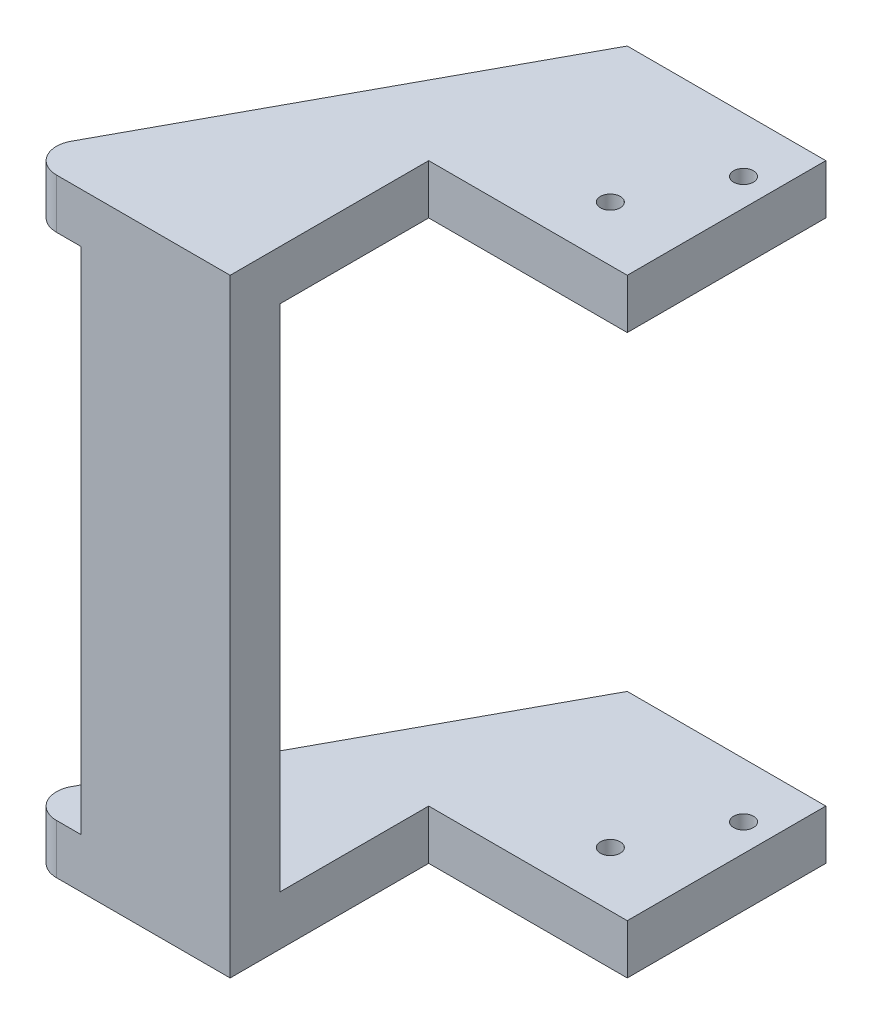
ISO-10303-21;
HEADER;
FILE_DESCRIPTION(('STEP AP214'),'2;1');
FILE_NAME('part.step','',(''),(''),'','','');
FILE_SCHEMA(('AUTOMOTIVE_DESIGN { 1 0 10303 214 1 1 1 1 }'));
ENDSEC;
DATA;
#1=APPLICATION_CONTEXT('core data for automotive mechanical design processes');
#2=APPLICATION_PROTOCOL_DEFINITION('international standard','automotive_design',2000,#1);
#3=PRODUCT_CONTEXT('',#1,'mechanical');
#4=PRODUCT('Part','Part','',(#3));
#5=PRODUCT_RELATED_PRODUCT_CATEGORY('part','',(#4));
#6=PRODUCT_DEFINITION_FORMATION('','',#4);
#7=PRODUCT_DEFINITION_CONTEXT('part definition',#1,'design');
#8=PRODUCT_DEFINITION('design','',#6,#7);
#9=PRODUCT_DEFINITION_SHAPE('','',#8);
#10=(LENGTH_UNIT() NAMED_UNIT(*) SI_UNIT(.MILLI.,.METRE.));
#11=(NAMED_UNIT(*) PLANE_ANGLE_UNIT() SI_UNIT($,.RADIAN.));
#12=(NAMED_UNIT(*) SI_UNIT($,.STERADIAN.) SOLID_ANGLE_UNIT());
#13=UNCERTAINTY_MEASURE_WITH_UNIT(LENGTH_MEASURE(1.E-05),#10,'distance_accuracy_value','');
#14=(GEOMETRIC_REPRESENTATION_CONTEXT(3) GLOBAL_UNCERTAINTY_ASSIGNED_CONTEXT((#13)) GLOBAL_UNIT_ASSIGNED_CONTEXT((#10,
#11,#12)) REPRESENTATION_CONTEXT('',''));
#15=CARTESIAN_POINT('',(0.,0.,0.));
#16=DIRECTION('',(0.,0.,1.));
#17=DIRECTION('',(1.,0.,0.));
#18=AXIS2_PLACEMENT_3D('',#15,#16,#17);
#19=CARTESIAN_POINT('',(-20.,-30.65,40.));
#20=DIRECTION('',(0.,1.,0.));
#21=DIRECTION('',(0.,0.,1.));
#22=AXIS2_PLACEMENT_3D('',#19,#20,#21);
#23=PLANE('',#22);
#24=CARTESIAN_POINT('',(12.765,-30.65,14.47));
#25=DIRECTION('',(0.,-1.,0.));
#26=DIRECTION('',(0.,0.,-1.));
#27=AXIS2_PLACEMENT_3D('',#24,#25,#26);
#28=CIRCLE('',#27,1.);
#29=CARTESIAN_POINT('',(12.765,-30.65,13.47));
#30=VERTEX_POINT('',#29);
#31=EDGE_CURVE('E305',#30,#30,#28,.T.);
#32=ORIENTED_EDGE('',*,*,#31,.F.);
#33=EDGE_LOOP('',(#32));
#34=FACE_BOUND('',#33,.T.);
#35=CARTESIAN_POINT('',(17.2371359549996,-30.65,5.52572809000084));
#36=DIRECTION('',(0.,-1.,0.));
#37=DIRECTION('',(0.,0.,-1.));
#38=AXIS2_PLACEMENT_3D('',#35,#36,#37);
#39=CIRCLE('',#38,1.);
#40=CARTESIAN_POINT('',(17.2371359549996,-30.65,4.52572809000084));
#41=VERTEX_POINT('',#40);
#42=EDGE_CURVE('E310',#41,#41,#39,.T.);
#43=ORIENTED_EDGE('',*,*,#42,.F.);
#44=EDGE_LOOP('',(#43));
#45=FACE_BOUND('',#44,.T.);
#46=DIRECTION('',(1.,0.,0.));
#47=VECTOR('',#46,1.);
#48=CARTESIAN_POINT('',(0.,-30.65,20.));
#49=LINE('',#48,#47);
#50=CARTESIAN_POINT('',(0.,-30.65,20.));
#51=VERTEX_POINT('',#50);
#52=CARTESIAN_POINT('',(20.,-30.65,20.));
#53=VERTEX_POINT('',#52);
#54=EDGE_CURVE('E84',#51,#53,#49,.T.);
#55=ORIENTED_EDGE('',*,*,#54,.F.);
#56=DIRECTION('',(0.,0.,-1.));
#57=VECTOR('',#56,1.);
#58=CARTESIAN_POINT('',(0.,-30.65,0.));
#59=LINE('',#58,#57);
#60=CARTESIAN_POINT('',(0.,-30.65,40.));
#61=VERTEX_POINT('',#60);
#62=EDGE_CURVE('E194',#61,#51,#59,.T.);
#63=ORIENTED_EDGE('',*,*,#62,.F.);
#64=DIRECTION('',(1.,0.,0.));
#65=VECTOR('',#64,1.);
#66=CARTESIAN_POINT('',(-20.,-30.65,40.));
#67=LINE('',#66,#65);
#68=CARTESIAN_POINT('',(-17.5,-30.65,40.));
#69=VERTEX_POINT('',#68);
#70=EDGE_CURVE('E277',#69,#61,#67,.T.);
#71=ORIENTED_EDGE('',*,*,#70,.F.);
#72=CARTESIAN_POINT('',(-17.5,-30.65,37.5));
#73=DIRECTION('',(0.,-1.,0.));
#74=DIRECTION('',(0.,0.,-1.));
#75=AXIS2_PLACEMENT_3D('',#72,#73,#74);
#76=CIRCLE('',#75,2.5);
#77=CARTESIAN_POINT('',(-19.6974514108383,-30.65,36.3078560082755));
#78=VERTEX_POINT('',#77);
#79=EDGE_CURVE('E229',#69,#78,#76,.T.);
#80=ORIENTED_EDGE('',*,*,#79,.T.);
#81=DIRECTION('',(-0.476857596689811,0.,0.878980564335309));
#82=VECTOR('',#81,1.);
#83=CARTESIAN_POINT('',(0.,-30.65,0.));
#84=LINE('',#83,#82);
#85=CARTESIAN_POINT('',(0.,-30.65,0.));
#86=VERTEX_POINT('',#85);
#87=EDGE_CURVE('E202',#86,#78,#84,.T.);
#88=ORIENTED_EDGE('',*,*,#87,.F.);
#89=DIRECTION('',(1.,0.,0.));
#90=VECTOR('',#89,1.);
#91=CARTESIAN_POINT('',(-20.,-30.65,0.));
#92=LINE('',#91,#90);
#93=CARTESIAN_POINT('',(20.,-30.65,0.));
#94=VERTEX_POINT('',#93);
#95=EDGE_CURVE('E274',#86,#94,#92,.T.);
#96=ORIENTED_EDGE('',*,*,#95,.T.);
#97=DIRECTION('',(0.,0.,-1.));
#98=VECTOR('',#97,1.);
#99=CARTESIAN_POINT('',(20.,-30.65,40.));
#100=LINE('',#99,#98);
#101=EDGE_CURVE('E292',#53,#94,#100,.T.);
#102=ORIENTED_EDGE('',*,*,#101,.F.);
#103=EDGE_LOOP('',(#55,#63,#71,#80,#88,#96,#102));
#104=FACE_BOUND('',#103,.T.);
#105=ADVANCED_FACE('F60',(#34,#45,#104),#23,.F.);
#106=CARTESIAN_POINT('',(-20.,30.65,40.));
#107=DIRECTION('',(0.,-1.,0.));
#108=DIRECTION('',(1.,0.,0.));
#109=AXIS2_PLACEMENT_3D('',#106,#107,#108);
#110=PLANE('',#109);
#111=CARTESIAN_POINT('',(12.765,30.65,14.47));
#112=DIRECTION('',(0.,-1.,0.));
#113=DIRECTION('',(0.,0.,-1.));
#114=AXIS2_PLACEMENT_3D('',#111,#112,#113);
#115=CIRCLE('',#114,1.);
#116=CARTESIAN_POINT('',(12.765,30.65,13.47));
#117=VERTEX_POINT('',#116);
#118=EDGE_CURVE('E300',#117,#117,#115,.T.);
#119=ORIENTED_EDGE('',*,*,#118,.T.);
#120=EDGE_LOOP('',(#119));
#121=FACE_BOUND('',#120,.T.);
#122=CARTESIAN_POINT('',(17.2371359549996,30.65,5.52572809000084));
#123=DIRECTION('',(0.,-1.,0.));
#124=DIRECTION('',(0.,0.,-1.));
#125=AXIS2_PLACEMENT_3D('',#122,#123,#124);
#126=CIRCLE('',#125,1.);
#127=CARTESIAN_POINT('',(17.2371359549996,30.65,4.52572809000084));
#128=VERTEX_POINT('',#127);
#129=EDGE_CURVE('E315',#128,#128,#126,.T.);
#130=ORIENTED_EDGE('',*,*,#129,.T.);
#131=EDGE_LOOP('',(#130));
#132=FACE_BOUND('',#131,.T.);
#133=DIRECTION('',(-1.,0.,0.));
#134=VECTOR('',#133,1.);
#135=CARTESIAN_POINT('',(-20.,30.65,40.));
#136=LINE('',#135,#134);
#137=CARTESIAN_POINT('',(0.,30.65,40.));
#138=VERTEX_POINT('',#137);
#139=CARTESIAN_POINT('',(-17.5,30.65,40.));
#140=VERTEX_POINT('',#139);
#141=EDGE_CURVE('E192',#138,#140,#136,.T.);
#142=ORIENTED_EDGE('',*,*,#141,.F.);
#143=DIRECTION('',(0.,0.,-1.));
#144=VECTOR('',#143,1.);
#145=CARTESIAN_POINT('',(0.,30.65,0.));
#146=LINE('',#145,#144);
#147=CARTESIAN_POINT('',(0.,30.65,20.));
#148=VERTEX_POINT('',#147);
#149=EDGE_CURVE('E177',#138,#148,#146,.T.);
#150=ORIENTED_EDGE('',*,*,#149,.T.);
#151=DIRECTION('',(1.,0.,0.));
#152=VECTOR('',#151,1.);
#153=CARTESIAN_POINT('',(0.,30.65,20.));
#154=LINE('',#153,#152);
#155=CARTESIAN_POINT('',(20.,30.65,20.));
#156=VERTEX_POINT('',#155);
#157=EDGE_CURVE('E185',#148,#156,#154,.T.);
#158=ORIENTED_EDGE('',*,*,#157,.T.);
#159=DIRECTION('',(0.,0.,-1.));
#160=VECTOR('',#159,1.);
#161=CARTESIAN_POINT('',(20.,30.65,40.));
#162=LINE('',#161,#160);
#163=CARTESIAN_POINT('',(20.,30.65,0.));
#164=VERTEX_POINT('',#163);
#165=EDGE_CURVE('E282',#156,#164,#162,.T.);
#166=ORIENTED_EDGE('',*,*,#165,.T.);
#167=DIRECTION('',(-1.,0.,0.));
#168=VECTOR('',#167,1.);
#169=CARTESIAN_POINT('',(-20.,30.65,0.));
#170=LINE('',#169,#168);
#171=CARTESIAN_POINT('',(0.,30.65,0.));
#172=VERTEX_POINT('',#171);
#173=EDGE_CURVE('E280',#164,#172,#170,.T.);
#174=ORIENTED_EDGE('',*,*,#173,.T.);
#175=DIRECTION('',(-0.476857596689811,0.,0.878980564335309));
#176=VECTOR('',#175,1.);
#177=CARTESIAN_POINT('',(0.,30.65,0.));
#178=LINE('',#177,#176);
#179=CARTESIAN_POINT('',(-19.6974514108383,30.65,36.3078560082755));
#180=VERTEX_POINT('',#179);
#181=EDGE_CURVE('E204',#172,#180,#178,.T.);
#182=ORIENTED_EDGE('',*,*,#181,.T.);
#183=CARTESIAN_POINT('',(-17.5,30.65,37.5));
#184=DIRECTION('',(0.,-1.,0.));
#185=DIRECTION('',(0.,0.,-1.));
#186=AXIS2_PLACEMENT_3D('',#183,#184,#185);
#187=CIRCLE('',#186,2.5);
#188=EDGE_CURVE('E230',#140,#180,#187,.T.);
#189=ORIENTED_EDGE('',*,*,#188,.F.);
#190=EDGE_LOOP('',(#142,#150,#158,#166,#174,#182,#189));
#191=FACE_BOUND('',#190,.T.);
#192=ADVANCED_FACE('F190',(#121,#132,#191),#110,.F.);
#193=CARTESIAN_POINT('',(0.,-25.65,0.));
#194=DIRECTION('',(0.,-1.,0.));
#195=DIRECTION('',(0.,0.,-1.));
#196=AXIS2_PLACEMENT_3D('',#193,#194,#195);
#197=PLANE('',#196);
#198=CARTESIAN_POINT('',(12.765,-25.65,14.47));
#199=DIRECTION('',(0.,-1.,0.));
#200=DIRECTION('',(0.,0.,-1.));
#201=AXIS2_PLACEMENT_3D('',#198,#199,#200);
#202=CIRCLE('',#201,1.);
#203=CARTESIAN_POINT('',(12.765,-25.65,13.47));
#204=VERTEX_POINT('',#203);
#205=EDGE_CURVE('E197',#204,#204,#202,.T.);
#206=ORIENTED_EDGE('',*,*,#205,.T.);
#207=EDGE_LOOP('',(#206));
#208=FACE_BOUND('',#207,.T.);
#209=CARTESIAN_POINT('',(17.2371359549996,-25.65,5.52572809000084));
#210=DIRECTION('',(0.,-1.,0.));
#211=DIRECTION('',(0.,0.,-1.));
#212=AXIS2_PLACEMENT_3D('',#209,#210,#211);
#213=CIRCLE('',#212,1.);
#214=CARTESIAN_POINT('',(17.2371359549996,-25.65,4.52572809000084));
#215=VERTEX_POINT('',#214);
#216=EDGE_CURVE('E299',#215,#215,#213,.T.);
#217=ORIENTED_EDGE('',*,*,#216,.T.);
#218=EDGE_LOOP('',(#217));
#219=FACE_BOUND('',#218,.T.);
#220=DIRECTION('',(1.,0.,0.));
#221=VECTOR('',#220,1.);
#222=CARTESIAN_POINT('',(-20.,-25.65,35.));
#223=LINE('',#222,#221);
#224=CARTESIAN_POINT('',(-15.,-25.65,35.));
#225=VERTEX_POINT('',#224);
#226=CARTESIAN_POINT('',(0.,-25.65,35.));
#227=VERTEX_POINT('',#226);
#228=EDGE_CURVE('E242',#225,#227,#223,.T.);
#229=ORIENTED_EDGE('',*,*,#228,.T.);
#230=DIRECTION('',(0.,0.,-1.));
#231=VECTOR('',#230,1.);
#232=CARTESIAN_POINT('',(0.,-25.65,0.));
#233=LINE('',#232,#231);
#234=CARTESIAN_POINT('',(0.,-25.65,20.));
#235=VERTEX_POINT('',#234);
#236=EDGE_CURVE('E216',#227,#235,#233,.T.);
#237=ORIENTED_EDGE('',*,*,#236,.T.);
#238=DIRECTION('',(1.,0.,0.));
#239=VECTOR('',#238,1.);
#240=CARTESIAN_POINT('',(0.,-25.65,20.));
#241=LINE('',#240,#239);
#242=CARTESIAN_POINT('',(20.,-25.65,20.));
#243=VERTEX_POINT('',#242);
#244=EDGE_CURVE('E226',#235,#243,#241,.T.);
#245=ORIENTED_EDGE('',*,*,#244,.T.);
#246=DIRECTION('',(0.,0.,1.));
#247=VECTOR('',#246,1.);
#248=CARTESIAN_POINT('',(20.,-25.65,0.));
#249=LINE('',#248,#247);
#250=CARTESIAN_POINT('',(20.,-25.65,0.));
#251=VERTEX_POINT('',#250);
#252=EDGE_CURVE('E269',#251,#243,#249,.T.);
#253=ORIENTED_EDGE('',*,*,#252,.F.);
#254=DIRECTION('',(1.,0.,0.));
#255=VECTOR('',#254,1.);
#256=CARTESIAN_POINT('',(0.,-25.65,0.));
#257=LINE('',#256,#255);
#258=CARTESIAN_POINT('',(0.,-25.65,0.));
#259=VERTEX_POINT('',#258);
#260=EDGE_CURVE('E265',#259,#251,#257,.T.);
#261=ORIENTED_EDGE('',*,*,#260,.F.);
#262=DIRECTION('',(-0.476857596689811,0.,0.878980564335309));
#263=VECTOR('',#262,1.);
#264=CARTESIAN_POINT('',(0.,-25.65,0.));
#265=LINE('',#264,#263);
#266=CARTESIAN_POINT('',(-19.6974514108383,-25.65,36.3078560082755));
#267=VERTEX_POINT('',#266);
#268=EDGE_CURVE('E222',#259,#267,#265,.T.);
#269=ORIENTED_EDGE('',*,*,#268,.T.);
#270=CARTESIAN_POINT('',(-17.5,-25.65,37.5));
#271=DIRECTION('',(0.,-1.,0.));
#272=DIRECTION('',(0.,0.,-1.));
#273=AXIS2_PLACEMENT_3D('',#270,#271,#272);
#274=CIRCLE('',#273,2.5);
#275=CARTESIAN_POINT('',(-17.5,-25.65,40.));
#276=VERTEX_POINT('',#275);
#277=EDGE_CURVE('E237',#276,#267,#274,.T.);
#278=ORIENTED_EDGE('',*,*,#277,.F.);
#279=DIRECTION('',(1.,0.,0.));
#280=VECTOR('',#279,1.);
#281=CARTESIAN_POINT('',(0.,-25.65,40.));
#282=LINE('',#281,#280);
#283=CARTESIAN_POINT('',(-15.,-25.65,40.));
#284=VERTEX_POINT('',#283);
#285=EDGE_CURVE('E251',#276,#284,#282,.T.);
#286=ORIENTED_EDGE('',*,*,#285,.T.);
#287=DIRECTION('',(0.,0.,1.));
#288=VECTOR('',#287,1.);
#289=CARTESIAN_POINT('',(-15.,-25.65,0.));
#290=LINE('',#289,#288);
#291=EDGE_CURVE('E259',#225,#284,#290,.T.);
#292=ORIENTED_EDGE('',*,*,#291,.F.);
#293=EDGE_LOOP('',(#229,#237,#245,#253,#261,#269,#278,#286,#292));
#294=FACE_BOUND('',#293,.T.);
#295=ADVANCED_FACE('F341',(#208,#219,#294),#197,.F.);
#296=CARTESIAN_POINT('',(0.,25.65,0.));
#297=DIRECTION('',(0.,-1.,0.));
#298=DIRECTION('',(0.,0.,-1.));
#299=AXIS2_PLACEMENT_3D('',#296,#297,#298);
#300=PLANE('',#299);
#301=CARTESIAN_POINT('',(12.765,25.65,14.47));
#302=DIRECTION('',(0.,-1.,0.));
#303=DIRECTION('',(0.,0.,-1.));
#304=AXIS2_PLACEMENT_3D('',#301,#302,#303);
#305=CIRCLE('',#304,1.);
#306=CARTESIAN_POINT('',(12.765,25.65,13.47));
#307=VERTEX_POINT('',#306);
#308=EDGE_CURVE('E63',#307,#307,#305,.T.);
#309=ORIENTED_EDGE('',*,*,#308,.F.);
#310=EDGE_LOOP('',(#309));
#311=FACE_BOUND('',#310,.T.);
#312=CARTESIAN_POINT('',(17.2371359549996,25.65,5.52572809000084));
#313=DIRECTION('',(0.,-1.,0.));
#314=DIRECTION('',(0.,0.,-1.));
#315=AXIS2_PLACEMENT_3D('',#312,#313,#314);
#316=CIRCLE('',#315,1.);
#317=CARTESIAN_POINT('',(17.2371359549996,25.65,4.52572809000084));
#318=VERTEX_POINT('',#317);
#319=EDGE_CURVE('E297',#318,#318,#316,.T.);
#320=ORIENTED_EDGE('',*,*,#319,.F.);
#321=EDGE_LOOP('',(#320));
#322=FACE_BOUND('',#321,.T.);
#323=DIRECTION('',(0.,0.,-1.));
#324=VECTOR('',#323,1.);
#325=CARTESIAN_POINT('',(0.,25.65,0.));
#326=LINE('',#325,#324);
#327=CARTESIAN_POINT('',(0.,25.65,35.));
#328=VERTEX_POINT('',#327);
#329=CARTESIAN_POINT('',(0.,25.65,20.));
#330=VERTEX_POINT('',#329);
#331=EDGE_CURVE('E180',#328,#330,#326,.T.);
#332=ORIENTED_EDGE('',*,*,#331,.F.);
#333=DIRECTION('',(1.,0.,0.));
#334=VECTOR('',#333,1.);
#335=CARTESIAN_POINT('',(-20.,25.65,35.));
#336=LINE('',#335,#334);
#337=CARTESIAN_POINT('',(-15.,25.65,35.));
#338=VERTEX_POINT('',#337);
#339=EDGE_CURVE('E243',#338,#328,#336,.T.);
#340=ORIENTED_EDGE('',*,*,#339,.F.);
#341=DIRECTION('',(0.,0.,1.));
#342=VECTOR('',#341,1.);
#343=CARTESIAN_POINT('',(-15.,25.65,0.));
#344=LINE('',#343,#342);
#345=CARTESIAN_POINT('',(-15.,25.65,40.));
#346=VERTEX_POINT('',#345);
#347=EDGE_CURVE('E260',#338,#346,#344,.T.);
#348=ORIENTED_EDGE('',*,*,#347,.T.);
#349=DIRECTION('',(-1.,0.,0.));
#350=VECTOR('',#349,1.);
#351=CARTESIAN_POINT('',(0.,25.65,40.));
#352=LINE('',#351,#350);
#353=CARTESIAN_POINT('',(-17.5,25.65,40.));
#354=VERTEX_POINT('',#353);
#355=EDGE_CURVE('E256',#346,#354,#352,.T.);
#356=ORIENTED_EDGE('',*,*,#355,.T.);
#357=CARTESIAN_POINT('',(-17.5,25.65,37.5));
#358=DIRECTION('',(0.,-1.,0.));
#359=DIRECTION('',(0.,0.,-1.));
#360=AXIS2_PLACEMENT_3D('',#357,#358,#359);
#361=CIRCLE('',#360,2.5);
#362=CARTESIAN_POINT('',(-19.6974514108383,25.65,36.3078560082755));
#363=VERTEX_POINT('',#362);
#364=EDGE_CURVE('E294',#354,#363,#361,.T.);
#365=ORIENTED_EDGE('',*,*,#364,.T.);
#366=DIRECTION('',(-0.476857596689811,0.,0.878980564335309));
#367=VECTOR('',#366,1.);
#368=CARTESIAN_POINT('',(0.,25.65,0.));
#369=LINE('',#368,#367);
#370=CARTESIAN_POINT('',(0.,25.65,0.));
#371=VERTEX_POINT('',#370);
#372=EDGE_CURVE('E219',#371,#363,#369,.T.);
#373=ORIENTED_EDGE('',*,*,#372,.F.);
#374=DIRECTION('',(1.,0.,0.));
#375=VECTOR('',#374,1.);
#376=CARTESIAN_POINT('',(0.,25.65,0.));
#377=LINE('',#376,#375);
#378=CARTESIAN_POINT('',(20.,25.65,0.));
#379=VERTEX_POINT('',#378);
#380=EDGE_CURVE('E267',#371,#379,#377,.T.);
#381=ORIENTED_EDGE('',*,*,#380,.T.);
#382=DIRECTION('',(0.,0.,1.));
#383=VECTOR('',#382,1.);
#384=CARTESIAN_POINT('',(20.,25.65,0.));
#385=LINE('',#384,#383);
#386=CARTESIAN_POINT('',(20.,25.65,20.));
#387=VERTEX_POINT('',#386);
#388=EDGE_CURVE('E271',#379,#387,#385,.T.);
#389=ORIENTED_EDGE('',*,*,#388,.T.);
#390=DIRECTION('',(1.,0.,0.));
#391=VECTOR('',#390,1.);
#392=CARTESIAN_POINT('',(0.,25.65,20.));
#393=LINE('',#392,#391);
#394=EDGE_CURVE('E76',#330,#387,#393,.T.);
#395=ORIENTED_EDGE('',*,*,#394,.F.);
#396=EDGE_LOOP('',(#332,#340,#348,#356,#365,#373,#381,#389,#395));
#397=FACE_BOUND('',#396,.T.);
#398=ADVANCED_FACE('F383',(#311,#322,#397),#300,.T.);
#399=CARTESIAN_POINT('',(0.,0.,40.));
#400=DIRECTION('',(0.,0.,1.));
#401=DIRECTION('',(1.,0.,0.));
#402=AXIS2_PLACEMENT_3D('',#399,#400,#401);
#403=PLANE('',#402);
#404=DIRECTION('',(0.,-1.,0.));
#405=VECTOR('',#404,1.);
#406=CARTESIAN_POINT('',(0.,25.65,40.));
#407=LINE('',#406,#405);
#408=EDGE_CURVE('E262',#138,#61,#407,.T.);
#409=ORIENTED_EDGE('',*,*,#408,.F.);
#410=ORIENTED_EDGE('',*,*,#141,.T.);
#411=DIRECTION('',(0.,-1.,0.));
#412=VECTOR('',#411,1.);
#413=CARTESIAN_POINT('',(-17.5,30.65,40.));
#414=LINE('',#413,#412);
#415=EDGE_CURVE('E234',#140,#354,#414,.T.);
#416=ORIENTED_EDGE('',*,*,#415,.T.);
#417=ORIENTED_EDGE('',*,*,#355,.F.);
#418=DIRECTION('',(0.,1.,0.));
#419=VECTOR('',#418,1.);
#420=CARTESIAN_POINT('',(-15.,0.,40.));
#421=LINE('',#420,#419);
#422=EDGE_CURVE('E253',#284,#346,#421,.T.);
#423=ORIENTED_EDGE('',*,*,#422,.F.);
#424=ORIENTED_EDGE('',*,*,#285,.F.);
#425=EDGE_CURVE('E232',#276,#69,#414,.T.);
#426=ORIENTED_EDGE('',*,*,#425,.T.);
#427=ORIENTED_EDGE('',*,*,#70,.T.);
#428=EDGE_LOOP('',(#409,#410,#416,#417,#423,#424,#426,#427));
#429=FACE_BOUND('',#428,.T.);
#430=ADVANCED_FACE('F361',(#429),#403,.T.);
#431=CARTESIAN_POINT('',(0.,0.,0.));
#432=DIRECTION('',(0.,0.,1.));
#433=DIRECTION('',(1.,0.,0.));
#434=AXIS2_PLACEMENT_3D('',#431,#432,#433);
#435=PLANE('',#434);
#436=ORIENTED_EDGE('',*,*,#380,.F.);
#437=DIRECTION('',(0.,-1.,0.));
#438=VECTOR('',#437,1.);
#439=CARTESIAN_POINT('',(0.,30.65,0.));
#440=LINE('',#439,#438);
#441=EDGE_CURVE('E207',#172,#371,#440,.T.);
#442=ORIENTED_EDGE('',*,*,#441,.F.);
#443=ORIENTED_EDGE('',*,*,#173,.F.);
#444=DIRECTION('',(0.,1.,0.));
#445=VECTOR('',#444,1.);
#446=CARTESIAN_POINT('',(20.,30.65,0.));
#447=LINE('',#446,#445);
#448=EDGE_CURVE('E285',#379,#164,#447,.T.);
#449=ORIENTED_EDGE('',*,*,#448,.F.);
#450=EDGE_LOOP('',(#436,#442,#443,#449));
#451=FACE_BOUND('',#450,.T.);
#452=ADVANCED_FACE('F393',(#451),#435,.F.);
#453=CARTESIAN_POINT('',(20.,30.65,40.));
#454=DIRECTION('',(-1.,0.,0.));
#455=DIRECTION('',(0.,-1.,0.));
#456=AXIS2_PLACEMENT_3D('',#453,#454,#455);
#457=PLANE('',#456);
#458=ORIENTED_EDGE('',*,*,#165,.F.);
#459=DIRECTION('',(0.,-1.,0.));
#460=VECTOR('',#459,1.);
#461=CARTESIAN_POINT('',(20.,30.65,20.));
#462=LINE('',#461,#460);
#463=EDGE_CURVE('E181',#156,#387,#462,.T.);
#464=ORIENTED_EDGE('',*,*,#463,.T.);
#465=ORIENTED_EDGE('',*,*,#388,.F.);
#466=ORIENTED_EDGE('',*,*,#448,.T.);
#467=EDGE_LOOP('',(#458,#464,#465,#466));
#468=FACE_BOUND('',#467,.T.);
#469=ADVANCED_FACE('F390',(#468),#457,.F.);
#470=ORIENTED_EDGE('',*,*,#252,.T.);
#471=DIRECTION('',(0.,-1.,0.));
#472=VECTOR('',#471,1.);
#473=CARTESIAN_POINT('',(20.,30.65,20.));
#474=LINE('',#473,#472);
#475=EDGE_CURVE('E12',#243,#53,#474,.T.);
#476=ORIENTED_EDGE('',*,*,#475,.T.);
#477=ORIENTED_EDGE('',*,*,#101,.T.);
#478=EDGE_CURVE('E286',#94,#251,#447,.T.);
#479=ORIENTED_EDGE('',*,*,#478,.T.);
#480=EDGE_LOOP('',(#470,#476,#477,#479));
#481=FACE_BOUND('',#480,.T.);
#482=ADVANCED_FACE('F354',(#481),#457,.F.);
#483=ORIENTED_EDGE('',*,*,#95,.F.);
#484=DIRECTION('',(0.,1.,0.));
#485=VECTOR('',#484,1.);
#486=CARTESIAN_POINT('',(0.,0.,0.));
#487=LINE('',#486,#485);
#488=EDGE_CURVE('E68',#86,#259,#487,.T.);
#489=ORIENTED_EDGE('',*,*,#488,.T.);
#490=ORIENTED_EDGE('',*,*,#260,.T.);
#491=ORIENTED_EDGE('',*,*,#478,.F.);
#492=EDGE_LOOP('',(#483,#489,#490,#491));
#493=FACE_BOUND('',#492,.T.);
#494=ADVANCED_FACE('F373',(#493),#435,.F.);
#495=CARTESIAN_POINT('',(0.,25.65,0.));
#496=DIRECTION('',(-1.,0.,0.));
#497=DIRECTION('',(0.,0.,1.));
#498=AXIS2_PLACEMENT_3D('',#495,#496,#497);
#499=PLANE('',#498);
#500=ORIENTED_EDGE('',*,*,#408,.T.);
#501=ORIENTED_EDGE('',*,*,#62,.T.);
#502=DIRECTION('',(0.,-1.,0.));
#503=VECTOR('',#502,1.);
#504=CARTESIAN_POINT('',(0.,30.65,20.));
#505=LINE('',#504,#503);
#506=EDGE_CURVE('E182',#235,#51,#505,.T.);
#507=ORIENTED_EDGE('',*,*,#506,.F.);
#508=ORIENTED_EDGE('',*,*,#236,.F.);
#509=DIRECTION('',(0.,-1.,0.));
#510=VECTOR('',#509,1.);
#511=CARTESIAN_POINT('',(0.,25.65,35.));
#512=LINE('',#511,#510);
#513=EDGE_CURVE('E239',#328,#227,#512,.T.);
#514=ORIENTED_EDGE('',*,*,#513,.F.);
#515=ORIENTED_EDGE('',*,*,#331,.T.);
#516=EDGE_CURVE('E173',#148,#330,#505,.T.);
#517=ORIENTED_EDGE('',*,*,#516,.F.);
#518=ORIENTED_EDGE('',*,*,#149,.F.);
#519=EDGE_LOOP('',(#500,#501,#507,#508,#514,#515,#517,#518));
#520=FACE_BOUND('',#519,.T.);
#521=ADVANCED_FACE('F175',(#520),#499,.F.);
#522=CARTESIAN_POINT('',(-15.,0.,0.));
#523=DIRECTION('',(1.,0.,0.));
#524=DIRECTION('',(0.,0.,-1.));
#525=AXIS2_PLACEMENT_3D('',#522,#523,#524);
#526=PLANE('',#525);
#527=ORIENTED_EDGE('',*,*,#347,.F.);
#528=DIRECTION('',(0.,-1.,0.));
#529=VECTOR('',#528,1.);
#530=CARTESIAN_POINT('',(-15.,0.,35.));
#531=LINE('',#530,#529);
#532=EDGE_CURVE('E246',#338,#225,#531,.T.);
#533=ORIENTED_EDGE('',*,*,#532,.T.);
#534=ORIENTED_EDGE('',*,*,#291,.T.);
#535=ORIENTED_EDGE('',*,*,#422,.T.);
#536=EDGE_LOOP('',(#527,#533,#534,#535));
#537=FACE_BOUND('',#536,.T.);
#538=ADVANCED_FACE('F378',(#537),#526,.F.);
#539=CARTESIAN_POINT('',(-20.,25.65,35.));
#540=DIRECTION('',(0.,0.,1.));
#541=DIRECTION('',(1.,0.,0.));
#542=AXIS2_PLACEMENT_3D('',#539,#540,#541);
#543=PLANE('',#542);
#544=ORIENTED_EDGE('',*,*,#339,.T.);
#545=ORIENTED_EDGE('',*,*,#513,.T.);
#546=ORIENTED_EDGE('',*,*,#228,.F.);
#547=ORIENTED_EDGE('',*,*,#532,.F.);
#548=EDGE_LOOP('',(#544,#545,#546,#547));
#549=FACE_BOUND('',#548,.T.);
#550=ADVANCED_FACE('F381',(#549),#543,.F.);
#551=CARTESIAN_POINT('',(-17.5,30.65,37.5));
#552=DIRECTION('',(0.,-1.,0.));
#553=DIRECTION('',(0.,0.,-1.));
#554=AXIS2_PLACEMENT_3D('',#551,#552,#553);
#555=CYLINDRICAL_SURFACE('',#554,2.5);
#556=ORIENTED_EDGE('',*,*,#415,.F.);
#557=ORIENTED_EDGE('',*,*,#188,.T.);
#558=DIRECTION('',(0.,-1.,0.));
#559=VECTOR('',#558,1.);
#560=CARTESIAN_POINT('',(-19.6974514108383,30.65,36.3078560082755));
#561=LINE('',#560,#559);
#562=EDGE_CURVE('E210',#180,#363,#561,.T.);
#563=ORIENTED_EDGE('',*,*,#562,.T.);
#564=ORIENTED_EDGE('',*,*,#364,.F.);
#565=EDGE_LOOP('',(#556,#557,#563,#564));
#566=FACE_BOUND('',#565,.T.);
#567=ADVANCED_FACE('F399',(#566),#555,.T.);
#568=ORIENTED_EDGE('',*,*,#277,.T.);
#569=EDGE_CURVE('E213',#267,#78,#561,.T.);
#570=ORIENTED_EDGE('',*,*,#569,.T.);
#571=ORIENTED_EDGE('',*,*,#79,.F.);
#572=ORIENTED_EDGE('',*,*,#425,.F.);
#573=EDGE_LOOP('',(#568,#570,#571,#572));
#574=FACE_BOUND('',#573,.T.);
#575=ADVANCED_FACE('F368',(#574),#555,.T.);
#576=CARTESIAN_POINT('',(0.,30.65,0.));
#577=DIRECTION('',(0.878980564335309,0.,0.476857596689811));
#578=DIRECTION('',(0.476857596689811,0.,-0.878980564335309));
#579=AXIS2_PLACEMENT_3D('',#576,#577,#578);
#580=PLANE('',#579);
#581=ORIENTED_EDGE('',*,*,#488,.F.);
#582=ORIENTED_EDGE('',*,*,#87,.T.);
#583=ORIENTED_EDGE('',*,*,#569,.F.);
#584=ORIENTED_EDGE('',*,*,#268,.F.);
#585=EDGE_LOOP('',(#581,#582,#583,#584));
#586=FACE_BOUND('',#585,.T.);
#587=ADVANCED_FACE('F371',(#586),#580,.F.);
#588=ORIENTED_EDGE('',*,*,#372,.T.);
#589=ORIENTED_EDGE('',*,*,#562,.F.);
#590=ORIENTED_EDGE('',*,*,#181,.F.);
#591=ORIENTED_EDGE('',*,*,#441,.T.);
#592=EDGE_LOOP('',(#588,#589,#590,#591));
#593=FACE_BOUND('',#592,.T.);
#594=ADVANCED_FACE('F397',(#593),#580,.F.);
#595=CARTESIAN_POINT('',(0.,30.65,20.));
#596=DIRECTION('',(0.,0.,-1.));
#597=DIRECTION('',(-1.,0.,0.));
#598=AXIS2_PLACEMENT_3D('',#595,#596,#597);
#599=PLANE('',#598);
#600=ORIENTED_EDGE('',*,*,#506,.T.);
#601=ORIENTED_EDGE('',*,*,#54,.T.);
#602=ORIENTED_EDGE('',*,*,#475,.F.);
#603=ORIENTED_EDGE('',*,*,#244,.F.);
#604=EDGE_LOOP('',(#600,#601,#602,#603));
#605=FACE_BOUND('',#604,.T.);
#606=ADVANCED_FACE('F332',(#605),#599,.F.);
#607=ORIENTED_EDGE('',*,*,#394,.T.);
#608=ORIENTED_EDGE('',*,*,#463,.F.);
#609=ORIENTED_EDGE('',*,*,#157,.F.);
#610=ORIENTED_EDGE('',*,*,#516,.T.);
#611=EDGE_LOOP('',(#607,#608,#609,#610));
#612=FACE_BOUND('',#611,.T.);
#613=ADVANCED_FACE('F186',(#612),#599,.F.);
#614=CARTESIAN_POINT('',(17.2371359549996,30.65,5.52572809000084));
#615=DIRECTION('',(0.,-1.,0.));
#616=DIRECTION('',(0.,0.,-1.));
#617=AXIS2_PLACEMENT_3D('',#614,#615,#616);
#618=CYLINDRICAL_SURFACE('',#617,1.);
#619=ORIENTED_EDGE('',*,*,#319,.T.);
#620=EDGE_LOOP('',(#619));
#621=FACE_BOUND('',#620,.T.);
#622=ORIENTED_EDGE('',*,*,#129,.F.);
#623=EDGE_LOOP('',(#622));
#624=FACE_BOUND('',#623,.T.);
#625=ADVANCED_FACE('F320',(#621,#624),#618,.F.);
#626=CARTESIAN_POINT('',(12.765,30.65,14.47));
#627=DIRECTION('',(0.,-1.,0.));
#628=DIRECTION('',(0.,0.,-1.));
#629=AXIS2_PLACEMENT_3D('',#626,#627,#628);
#630=CYLINDRICAL_SURFACE('',#629,1.);
#631=ORIENTED_EDGE('',*,*,#308,.T.);
#632=EDGE_LOOP('',(#631));
#633=FACE_BOUND('',#632,.T.);
#634=ORIENTED_EDGE('',*,*,#118,.F.);
#635=EDGE_LOOP('',(#634));
#636=FACE_BOUND('',#635,.T.);
#637=ADVANCED_FACE('F322',(#633,#636),#630,.F.);
#638=ORIENTED_EDGE('',*,*,#42,.T.);
#639=EDGE_LOOP('',(#638));
#640=FACE_BOUND('',#639,.T.);
#641=ORIENTED_EDGE('',*,*,#216,.F.);
#642=EDGE_LOOP('',(#641));
#643=FACE_BOUND('',#642,.T.);
#644=ADVANCED_FACE('F324',(#640,#643),#618,.F.);
#645=ORIENTED_EDGE('',*,*,#31,.T.);
#646=EDGE_LOOP('',(#645));
#647=FACE_BOUND('',#646,.T.);
#648=ORIENTED_EDGE('',*,*,#205,.F.);
#649=EDGE_LOOP('',(#648));
#650=FACE_BOUND('',#649,.T.);
#651=ADVANCED_FACE('F331',(#647,#650),#630,.F.);
#652=CLOSED_SHELL('',(#105,#192,#295,#398,#430,#452,#469,#482,#494,#521,#538,#550,#567,#575,
#587,#594,#606,#613,#625,#637,#644,#651));
#653=MANIFOLD_SOLID_BREP('B2',#652);
#654=ADVANCED_BREP_SHAPE_REPRESENTATION('',(#18,#653),#14);
#655=SHAPE_DEFINITION_REPRESENTATION(#9,#654);
ENDSEC;
END-ISO-10303-21;
